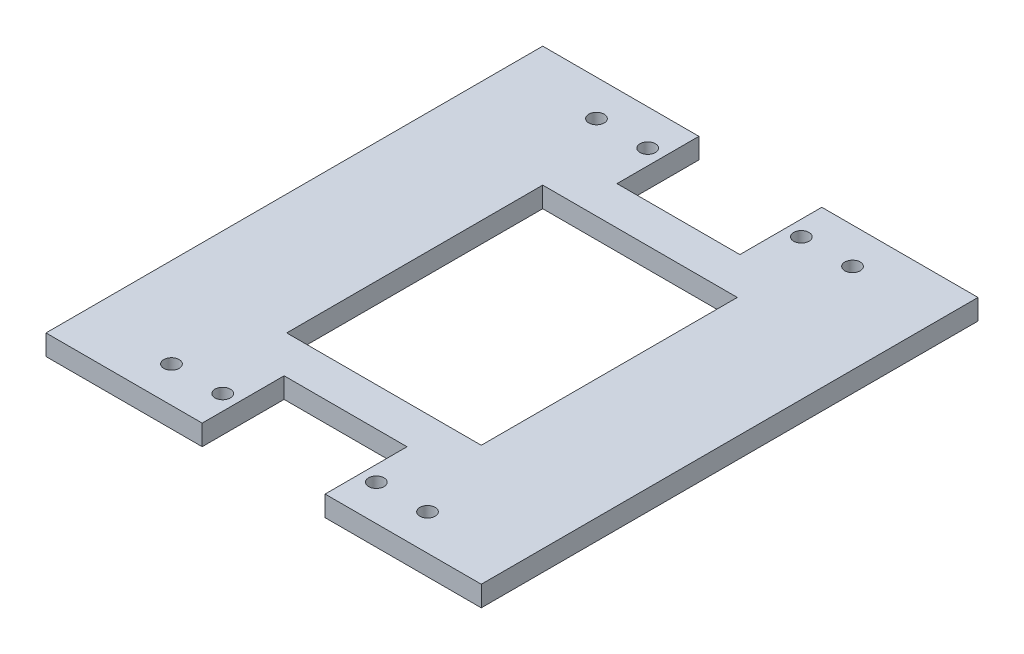
ISO-10303-21;
HEADER;
FILE_DESCRIPTION(('STEP AP214'),'2;1');
FILE_NAME('part.step','',(''),(''),'','','');
FILE_SCHEMA(('AUTOMOTIVE_DESIGN { 1 0 10303 214 1 1 1 1 }'));
ENDSEC;
DATA;
#1=APPLICATION_CONTEXT('core data for automotive mechanical design processes');
#2=APPLICATION_PROTOCOL_DEFINITION('international standard','automotive_design',2000,#1);
#3=PRODUCT_CONTEXT('',#1,'mechanical');
#4=PRODUCT('Part','Part','',(#3));
#5=PRODUCT_RELATED_PRODUCT_CATEGORY('part','',(#4));
#6=PRODUCT_DEFINITION_FORMATION('','',#4);
#7=PRODUCT_DEFINITION_CONTEXT('part definition',#1,'design');
#8=PRODUCT_DEFINITION('design','',#6,#7);
#9=PRODUCT_DEFINITION_SHAPE('','',#8);
#10=(LENGTH_UNIT() NAMED_UNIT(*) SI_UNIT(.MILLI.,.METRE.));
#11=(NAMED_UNIT(*) PLANE_ANGLE_UNIT() SI_UNIT($,.RADIAN.));
#12=(NAMED_UNIT(*) SI_UNIT($,.STERADIAN.) SOLID_ANGLE_UNIT());
#13=UNCERTAINTY_MEASURE_WITH_UNIT(LENGTH_MEASURE(1.E-05),#10,'distance_accuracy_value','');
#14=(GEOMETRIC_REPRESENTATION_CONTEXT(3) GLOBAL_UNCERTAINTY_ASSIGNED_CONTEXT((#13)) GLOBAL_UNIT_ASSIGNED_CONTEXT((#10,
#11,#12)) REPRESENTATION_CONTEXT('',''));
#15=CARTESIAN_POINT('',(0.,0.,0.));
#16=DIRECTION('',(0.,0.,1.));
#17=DIRECTION('',(1.,0.,0.));
#18=AXIS2_PLACEMENT_3D('',#15,#16,#17);
#19=CARTESIAN_POINT('',(0.,4.,0.));
#20=DIRECTION('',(0.,-1.,0.));
#21=DIRECTION('',(0.,0.,-1.));
#22=AXIS2_PLACEMENT_3D('',#19,#20,#21);
#23=PLANE('',#22);
#24=CARTESIAN_POINT('',(-25.,4.,41.5));
#25=DIRECTION('',(0.,1.,0.));
#26=DIRECTION('',(0.,0.,1.));
#27=AXIS2_PLACEMENT_3D('',#24,#25,#26);
#28=CIRCLE('',#27,1.5);
#29=CARTESIAN_POINT('',(-25.,4.,43.));
#30=VERTEX_POINT('',#29);
#31=EDGE_CURVE('E190',#30,#30,#28,.T.);
#32=ORIENTED_EDGE('',*,*,#31,.F.);
#33=EDGE_LOOP('',(#32));
#34=FACE_BOUND('',#33,.T.);
#35=CARTESIAN_POINT('',(-15.,4.,41.5));
#36=DIRECTION('',(0.,1.,0.));
#37=DIRECTION('',(0.,0.,1.));
#38=AXIS2_PLACEMENT_3D('',#35,#36,#37);
#39=CIRCLE('',#38,1.5);
#40=CARTESIAN_POINT('',(-15.,4.,43.));
#41=VERTEX_POINT('',#40);
#42=EDGE_CURVE('E196',#41,#41,#39,.T.);
#43=ORIENTED_EDGE('',*,*,#42,.F.);
#44=EDGE_LOOP('',(#43));
#45=FACE_BOUND('',#44,.T.);
#46=CARTESIAN_POINT('',(15.,4.,41.5));
#47=DIRECTION('',(0.,1.,0.));
#48=DIRECTION('',(0.,0.,-1.));
#49=AXIS2_PLACEMENT_3D('',#46,#47,#48);
#50=CIRCLE('',#49,1.5);
#51=CARTESIAN_POINT('',(15.,4.,40.));
#52=VERTEX_POINT('',#51);
#53=EDGE_CURVE('E202',#52,#52,#50,.T.);
#54=ORIENTED_EDGE('',*,*,#53,.F.);
#55=EDGE_LOOP('',(#54));
#56=FACE_BOUND('',#55,.T.);
#57=CARTESIAN_POINT('',(25.,4.,41.5));
#58=DIRECTION('',(0.,1.,0.));
#59=DIRECTION('',(0.,0.,-1.));
#60=AXIS2_PLACEMENT_3D('',#57,#58,#59);
#61=CIRCLE('',#60,1.5);
#62=CARTESIAN_POINT('',(25.,4.,40.));
#63=VERTEX_POINT('',#62);
#64=EDGE_CURVE('E208',#63,#63,#61,.T.);
#65=ORIENTED_EDGE('',*,*,#64,.F.);
#66=EDGE_LOOP('',(#65));
#67=FACE_BOUND('',#66,.T.);
#68=CARTESIAN_POINT('',(-15.,4.,-41.5));
#69=DIRECTION('',(0.,1.,0.));
#70=DIRECTION('',(0.,0.,-1.));
#71=AXIS2_PLACEMENT_3D('',#68,#69,#70);
#72=CIRCLE('',#71,1.5);
#73=CARTESIAN_POINT('',(-15.,4.,-43.));
#74=VERTEX_POINT('',#73);
#75=EDGE_CURVE('E214',#74,#74,#72,.T.);
#76=ORIENTED_EDGE('',*,*,#75,.F.);
#77=EDGE_LOOP('',(#76));
#78=FACE_BOUND('',#77,.T.);
#79=CARTESIAN_POINT('',(-25.,4.,-41.5));
#80=DIRECTION('',(0.,1.,0.));
#81=DIRECTION('',(0.,0.,-1.));
#82=AXIS2_PLACEMENT_3D('',#79,#80,#81);
#83=CIRCLE('',#82,1.5);
#84=CARTESIAN_POINT('',(-25.,4.,-43.));
#85=VERTEX_POINT('',#84);
#86=EDGE_CURVE('E220',#85,#85,#83,.T.);
#87=ORIENTED_EDGE('',*,*,#86,.F.);
#88=EDGE_LOOP('',(#87));
#89=FACE_BOUND('',#88,.T.);
#90=CARTESIAN_POINT('',(25.,4.,-41.5));
#91=DIRECTION('',(0.,1.,0.));
#92=DIRECTION('',(0.,0.,1.));
#93=AXIS2_PLACEMENT_3D('',#90,#91,#92);
#94=CIRCLE('',#93,1.5);
#95=CARTESIAN_POINT('',(25.,4.,-40.));
#96=VERTEX_POINT('',#95);
#97=EDGE_CURVE('E226',#96,#96,#94,.T.);
#98=ORIENTED_EDGE('',*,*,#97,.F.);
#99=EDGE_LOOP('',(#98));
#100=FACE_BOUND('',#99,.T.);
#101=CARTESIAN_POINT('',(15.,4.,-41.5));
#102=DIRECTION('',(0.,1.,0.));
#103=DIRECTION('',(0.,0.,1.));
#104=AXIS2_PLACEMENT_3D('',#101,#102,#103);
#105=CIRCLE('',#104,1.5);
#106=CARTESIAN_POINT('',(15.,4.,-40.));
#107=VERTEX_POINT('',#106);
#108=EDGE_CURVE('E232',#107,#107,#105,.T.);
#109=ORIENTED_EDGE('',*,*,#108,.F.);
#110=EDGE_LOOP('',(#109));
#111=FACE_BOUND('',#110,.T.);
#112=DIRECTION('',(1.,0.,0.));
#113=VECTOR('',#112,1.);
#114=CARTESIAN_POINT('',(12.,4.,48.5));
#115=LINE('',#114,#113);
#116=CARTESIAN_POINT('',(12.,4.,48.5));
#117=VERTEX_POINT('',#116);
#118=CARTESIAN_POINT('',(42.5,4.,48.5));
#119=VERTEX_POINT('',#118);
#120=EDGE_CURVE('E238',#117,#119,#115,.T.);
#121=ORIENTED_EDGE('',*,*,#120,.T.);
#122=DIRECTION('',(0.,0.,-1.));
#123=VECTOR('',#122,1.);
#124=CARTESIAN_POINT('',(42.5,4.,-48.5));
#125=LINE('',#124,#123);
#126=CARTESIAN_POINT('',(42.5,4.,-48.5));
#127=VERTEX_POINT('',#126);
#128=EDGE_CURVE('E241',#119,#127,#125,.T.);
#129=ORIENTED_EDGE('',*,*,#128,.T.);
#130=DIRECTION('',(-1.,0.,0.));
#131=VECTOR('',#130,1.);
#132=CARTESIAN_POINT('',(12.,4.,-48.5));
#133=LINE('',#132,#131);
#134=CARTESIAN_POINT('',(12.,4.,-48.5));
#135=VERTEX_POINT('',#134);
#136=EDGE_CURVE('E244',#127,#135,#133,.T.);
#137=ORIENTED_EDGE('',*,*,#136,.T.);
#138=DIRECTION('',(0.,0.,1.));
#139=VECTOR('',#138,1.);
#140=CARTESIAN_POINT('',(12.,4.,-32.5));
#141=LINE('',#140,#139);
#142=CARTESIAN_POINT('',(12.,4.,-32.5));
#143=VERTEX_POINT('',#142);
#144=EDGE_CURVE('E246',#135,#143,#141,.T.);
#145=ORIENTED_EDGE('',*,*,#144,.T.);
#146=DIRECTION('',(-1.,0.,0.));
#147=VECTOR('',#146,1.);
#148=CARTESIAN_POINT('',(-12.,4.,-32.5));
#149=LINE('',#148,#147);
#150=CARTESIAN_POINT('',(-12.,4.,-32.5));
#151=VERTEX_POINT('',#150);
#152=EDGE_CURVE('E248',#143,#151,#149,.T.);
#153=ORIENTED_EDGE('',*,*,#152,.T.);
#154=DIRECTION('',(0.,0.,-1.));
#155=VECTOR('',#154,1.);
#156=CARTESIAN_POINT('',(-12.,4.,-48.5));
#157=LINE('',#156,#155);
#158=CARTESIAN_POINT('',(-12.,4.,-48.5));
#159=VERTEX_POINT('',#158);
#160=EDGE_CURVE('E250',#151,#159,#157,.T.);
#161=ORIENTED_EDGE('',*,*,#160,.T.);
#162=DIRECTION('',(-1.,0.,0.));
#163=VECTOR('',#162,1.);
#164=CARTESIAN_POINT('',(-42.5,4.,-48.5));
#165=LINE('',#164,#163);
#166=CARTESIAN_POINT('',(-42.5,4.,-48.5));
#167=VERTEX_POINT('',#166);
#168=EDGE_CURVE('E252',#159,#167,#165,.T.);
#169=ORIENTED_EDGE('',*,*,#168,.T.);
#170=DIRECTION('',(0.,0.,1.));
#171=VECTOR('',#170,1.);
#172=CARTESIAN_POINT('',(-42.5,4.,-48.5));
#173=LINE('',#172,#171);
#174=CARTESIAN_POINT('',(-42.5,4.,48.5));
#175=VERTEX_POINT('',#174);
#176=EDGE_CURVE('E254',#167,#175,#173,.T.);
#177=ORIENTED_EDGE('',*,*,#176,.T.);
#178=DIRECTION('',(1.,0.,0.));
#179=VECTOR('',#178,1.);
#180=CARTESIAN_POINT('',(-42.5,4.,48.5));
#181=LINE('',#180,#179);
#182=CARTESIAN_POINT('',(-12.,4.,48.5));
#183=VERTEX_POINT('',#182);
#184=EDGE_CURVE('E256',#175,#183,#181,.T.);
#185=ORIENTED_EDGE('',*,*,#184,.T.);
#186=DIRECTION('',(0.,0.,-1.));
#187=VECTOR('',#186,1.);
#188=CARTESIAN_POINT('',(-12.,4.,48.5));
#189=LINE('',#188,#187);
#190=CARTESIAN_POINT('',(-12.,4.,32.5));
#191=VERTEX_POINT('',#190);
#192=EDGE_CURVE('E258',#183,#191,#189,.T.);
#193=ORIENTED_EDGE('',*,*,#192,.T.);
#194=DIRECTION('',(1.,0.,0.));
#195=VECTOR('',#194,1.);
#196=CARTESIAN_POINT('',(-12.,4.,32.5));
#197=LINE('',#196,#195);
#198=CARTESIAN_POINT('',(12.,4.,32.5));
#199=VERTEX_POINT('',#198);
#200=EDGE_CURVE('E260',#191,#199,#197,.T.);
#201=ORIENTED_EDGE('',*,*,#200,.T.);
#202=DIRECTION('',(0.,0.,1.));
#203=VECTOR('',#202,1.);
#204=CARTESIAN_POINT('',(12.,4.,32.5));
#205=LINE('',#204,#203);
#206=EDGE_CURVE('E262',#199,#117,#205,.T.);
#207=ORIENTED_EDGE('',*,*,#206,.T.);
#208=EDGE_LOOP('',(#121,#129,#137,#145,#153,#161,#169,#177,#185,#193,#201,#207));
#209=FACE_BOUND('',#208,.T.);
#210=DIRECTION('',(0.,0.,-1.));
#211=VECTOR('',#210,1.);
#212=CARTESIAN_POINT('',(19.,4.,-25.));
#213=LINE('',#212,#211);
#214=CARTESIAN_POINT('',(19.,4.,25.));
#215=VERTEX_POINT('',#214);
#216=CARTESIAN_POINT('',(19.,4.,-25.));
#217=VERTEX_POINT('',#216);
#218=EDGE_CURVE('E154',#215,#217,#213,.T.);
#219=ORIENTED_EDGE('',*,*,#218,.F.);
#220=DIRECTION('',(1.,0.,0.));
#221=VECTOR('',#220,1.);
#222=CARTESIAN_POINT('',(-19.,4.,25.));
#223=LINE('',#222,#221);
#224=CARTESIAN_POINT('',(-19.,4.,25.));
#225=VERTEX_POINT('',#224);
#226=EDGE_CURVE('E176',#225,#215,#223,.T.);
#227=ORIENTED_EDGE('',*,*,#226,.F.);
#228=DIRECTION('',(0.,0.,1.));
#229=VECTOR('',#228,1.);
#230=CARTESIAN_POINT('',(-19.,4.,-25.));
#231=LINE('',#230,#229);
#232=CARTESIAN_POINT('',(-19.,4.,-25.));
#233=VERTEX_POINT('',#232);
#234=EDGE_CURVE('E174',#233,#225,#231,.T.);
#235=ORIENTED_EDGE('',*,*,#234,.F.);
#236=DIRECTION('',(-1.,0.,0.));
#237=VECTOR('',#236,1.);
#238=CARTESIAN_POINT('',(-19.,4.,-25.));
#239=LINE('',#238,#237);
#240=EDGE_CURVE('E162',#217,#233,#239,.T.);
#241=ORIENTED_EDGE('',*,*,#240,.F.);
#242=EDGE_LOOP('',(#219,#227,#235,#241));
#243=FACE_BOUND('',#242,.T.);
#244=ADVANCED_FACE('F41',(#34,#45,#56,#67,#78,#89,#100,#111,#209,#243),#23,.F.);
#245=CARTESIAN_POINT('',(0.,0.,0.));
#246=DIRECTION('',(0.,-1.,0.));
#247=DIRECTION('',(0.,0.,-1.));
#248=AXIS2_PLACEMENT_3D('',#245,#246,#247);
#249=PLANE('',#248);
#250=CARTESIAN_POINT('',(-15.,0.,41.5));
#251=DIRECTION('',(0.,1.,0.));
#252=DIRECTION('',(0.,0.,1.));
#253=AXIS2_PLACEMENT_3D('',#250,#251,#252);
#254=CIRCLE('',#253,1.5);
#255=CARTESIAN_POINT('',(-15.,0.,43.));
#256=VERTEX_POINT('',#255);
#257=EDGE_CURVE('E193',#256,#256,#254,.T.);
#258=ORIENTED_EDGE('',*,*,#257,.T.);
#259=EDGE_LOOP('',(#258));
#260=FACE_BOUND('',#259,.T.);
#261=CARTESIAN_POINT('',(25.,0.,41.5));
#262=DIRECTION('',(0.,1.,0.));
#263=DIRECTION('',(0.,0.,-1.));
#264=AXIS2_PLACEMENT_3D('',#261,#262,#263);
#265=CIRCLE('',#264,1.5);
#266=CARTESIAN_POINT('',(25.,0.,40.));
#267=VERTEX_POINT('',#266);
#268=EDGE_CURVE('E205',#267,#267,#265,.T.);
#269=ORIENTED_EDGE('',*,*,#268,.T.);
#270=EDGE_LOOP('',(#269));
#271=FACE_BOUND('',#270,.T.);
#272=CARTESIAN_POINT('',(-25.,0.,-41.5));
#273=DIRECTION('',(0.,1.,0.));
#274=DIRECTION('',(0.,0.,-1.));
#275=AXIS2_PLACEMENT_3D('',#272,#273,#274);
#276=CIRCLE('',#275,1.5);
#277=CARTESIAN_POINT('',(-25.,0.,-43.));
#278=VERTEX_POINT('',#277);
#279=EDGE_CURVE('E217',#278,#278,#276,.T.);
#280=ORIENTED_EDGE('',*,*,#279,.T.);
#281=EDGE_LOOP('',(#280));
#282=FACE_BOUND('',#281,.T.);
#283=CARTESIAN_POINT('',(15.,0.,-41.5));
#284=DIRECTION('',(0.,1.,0.));
#285=DIRECTION('',(0.,0.,1.));
#286=AXIS2_PLACEMENT_3D('',#283,#284,#285);
#287=CIRCLE('',#286,1.5);
#288=CARTESIAN_POINT('',(15.,0.,-40.));
#289=VERTEX_POINT('',#288);
#290=EDGE_CURVE('E229',#289,#289,#287,.T.);
#291=ORIENTED_EDGE('',*,*,#290,.T.);
#292=EDGE_LOOP('',(#291));
#293=FACE_BOUND('',#292,.T.);
#294=DIRECTION('',(1.,0.,0.));
#295=VECTOR('',#294,1.);
#296=CARTESIAN_POINT('',(12.,0.,48.5));
#297=LINE('',#296,#295);
#298=CARTESIAN_POINT('',(12.,0.,48.5));
#299=VERTEX_POINT('',#298);
#300=CARTESIAN_POINT('',(42.5,0.,48.5));
#301=VERTEX_POINT('',#300);
#302=EDGE_CURVE('E235',#299,#301,#297,.T.);
#303=ORIENTED_EDGE('',*,*,#302,.F.);
#304=DIRECTION('',(0.,0.,1.));
#305=VECTOR('',#304,1.);
#306=CARTESIAN_POINT('',(12.,0.,32.5));
#307=LINE('',#306,#305);
#308=CARTESIAN_POINT('',(12.,0.,32.5));
#309=VERTEX_POINT('',#308);
#310=EDGE_CURVE('E242',#309,#299,#307,.T.);
#311=ORIENTED_EDGE('',*,*,#310,.F.);
#312=DIRECTION('',(1.,0.,0.));
#313=VECTOR('',#312,1.);
#314=CARTESIAN_POINT('',(-12.,0.,32.5));
#315=LINE('',#314,#313);
#316=CARTESIAN_POINT('',(-12.,0.,32.5));
#317=VERTEX_POINT('',#316);
#318=EDGE_CURVE('E285',#317,#309,#315,.T.);
#319=ORIENTED_EDGE('',*,*,#318,.F.);
#320=DIRECTION('',(0.,0.,-1.));
#321=VECTOR('',#320,1.);
#322=CARTESIAN_POINT('',(-12.,0.,48.5));
#323=LINE('',#322,#321);
#324=CARTESIAN_POINT('',(-12.,0.,48.5));
#325=VERTEX_POINT('',#324);
#326=EDGE_CURVE('E283',#325,#317,#323,.T.);
#327=ORIENTED_EDGE('',*,*,#326,.F.);
#328=DIRECTION('',(1.,0.,0.));
#329=VECTOR('',#328,1.);
#330=CARTESIAN_POINT('',(-42.5,0.,48.5));
#331=LINE('',#330,#329);
#332=CARTESIAN_POINT('',(-42.5,0.,48.5));
#333=VERTEX_POINT('',#332);
#334=EDGE_CURVE('E281',#333,#325,#331,.T.);
#335=ORIENTED_EDGE('',*,*,#334,.F.);
#336=DIRECTION('',(0.,0.,1.));
#337=VECTOR('',#336,1.);
#338=CARTESIAN_POINT('',(-42.5,0.,-48.5));
#339=LINE('',#338,#337);
#340=CARTESIAN_POINT('',(-42.5,0.,-48.5));
#341=VERTEX_POINT('',#340);
#342=EDGE_CURVE('E279',#341,#333,#339,.T.);
#343=ORIENTED_EDGE('',*,*,#342,.F.);
#344=DIRECTION('',(-1.,0.,0.));
#345=VECTOR('',#344,1.);
#346=CARTESIAN_POINT('',(-42.5,0.,-48.5));
#347=LINE('',#346,#345);
#348=CARTESIAN_POINT('',(-12.,0.,-48.5));
#349=VERTEX_POINT('',#348);
#350=EDGE_CURVE('E277',#349,#341,#347,.T.);
#351=ORIENTED_EDGE('',*,*,#350,.F.);
#352=DIRECTION('',(0.,0.,-1.));
#353=VECTOR('',#352,1.);
#354=CARTESIAN_POINT('',(-12.,0.,-48.5));
#355=LINE('',#354,#353);
#356=CARTESIAN_POINT('',(-12.,0.,-32.5));
#357=VERTEX_POINT('',#356);
#358=EDGE_CURVE('E275',#357,#349,#355,.T.);
#359=ORIENTED_EDGE('',*,*,#358,.F.);
#360=DIRECTION('',(-1.,0.,0.));
#361=VECTOR('',#360,1.);
#362=CARTESIAN_POINT('',(-12.,0.,-32.5));
#363=LINE('',#362,#361);
#364=CARTESIAN_POINT('',(12.,0.,-32.5));
#365=VERTEX_POINT('',#364);
#366=EDGE_CURVE('E273',#365,#357,#363,.T.);
#367=ORIENTED_EDGE('',*,*,#366,.F.);
#368=DIRECTION('',(0.,0.,1.));
#369=VECTOR('',#368,1.);
#370=CARTESIAN_POINT('',(12.,0.,-32.5));
#371=LINE('',#370,#369);
#372=CARTESIAN_POINT('',(12.,0.,-48.5));
#373=VERTEX_POINT('',#372);
#374=EDGE_CURVE('E271',#373,#365,#371,.T.);
#375=ORIENTED_EDGE('',*,*,#374,.F.);
#376=DIRECTION('',(-1.,0.,0.));
#377=VECTOR('',#376,1.);
#378=CARTESIAN_POINT('',(12.,0.,-48.5));
#379=LINE('',#378,#377);
#380=CARTESIAN_POINT('',(42.5,0.,-48.5));
#381=VERTEX_POINT('',#380);
#382=EDGE_CURVE('E269',#381,#373,#379,.T.);
#383=ORIENTED_EDGE('',*,*,#382,.F.);
#384=DIRECTION('',(0.,0.,-1.));
#385=VECTOR('',#384,1.);
#386=CARTESIAN_POINT('',(42.5,0.,-48.5));
#387=LINE('',#386,#385);
#388=EDGE_CURVE('E267',#301,#381,#387,.T.);
#389=ORIENTED_EDGE('',*,*,#388,.F.);
#390=EDGE_LOOP('',(#303,#311,#319,#327,#335,#343,#351,#359,#367,#375,#383,#389));
#391=FACE_BOUND('',#390,.T.);
#392=CARTESIAN_POINT('',(25.,0.,-41.5));
#393=DIRECTION('',(0.,1.,0.));
#394=DIRECTION('',(0.,0.,1.));
#395=AXIS2_PLACEMENT_3D('',#392,#393,#394);
#396=CIRCLE('',#395,1.5);
#397=CARTESIAN_POINT('',(25.,0.,-40.));
#398=VERTEX_POINT('',#397);
#399=EDGE_CURVE('E223',#398,#398,#396,.T.);
#400=ORIENTED_EDGE('',*,*,#399,.T.);
#401=EDGE_LOOP('',(#400));
#402=FACE_BOUND('',#401,.T.);
#403=CARTESIAN_POINT('',(-15.,0.,-41.5));
#404=DIRECTION('',(0.,1.,0.));
#405=DIRECTION('',(0.,0.,-1.));
#406=AXIS2_PLACEMENT_3D('',#403,#404,#405);
#407=CIRCLE('',#406,1.5);
#408=CARTESIAN_POINT('',(-15.,0.,-43.));
#409=VERTEX_POINT('',#408);
#410=EDGE_CURVE('E211',#409,#409,#407,.T.);
#411=ORIENTED_EDGE('',*,*,#410,.T.);
#412=EDGE_LOOP('',(#411));
#413=FACE_BOUND('',#412,.T.);
#414=CARTESIAN_POINT('',(15.,0.,41.5));
#415=DIRECTION('',(0.,1.,0.));
#416=DIRECTION('',(0.,0.,-1.));
#417=AXIS2_PLACEMENT_3D('',#414,#415,#416);
#418=CIRCLE('',#417,1.5);
#419=CARTESIAN_POINT('',(15.,0.,40.));
#420=VERTEX_POINT('',#419);
#421=EDGE_CURVE('E199',#420,#420,#418,.T.);
#422=ORIENTED_EDGE('',*,*,#421,.T.);
#423=EDGE_LOOP('',(#422));
#424=FACE_BOUND('',#423,.T.);
#425=CARTESIAN_POINT('',(-25.,0.,41.5));
#426=DIRECTION('',(0.,1.,0.));
#427=DIRECTION('',(0.,0.,1.));
#428=AXIS2_PLACEMENT_3D('',#425,#426,#427);
#429=CIRCLE('',#428,1.5);
#430=CARTESIAN_POINT('',(-25.,0.,43.));
#431=VERTEX_POINT('',#430);
#432=EDGE_CURVE('E170',#431,#431,#429,.T.);
#433=ORIENTED_EDGE('',*,*,#432,.T.);
#434=EDGE_LOOP('',(#433));
#435=FACE_BOUND('',#434,.T.);
#436=DIRECTION('',(1.,0.,0.));
#437=VECTOR('',#436,1.);
#438=CARTESIAN_POINT('',(-19.,0.,25.));
#439=LINE('',#438,#437);
#440=CARTESIAN_POINT('',(-19.,0.,25.));
#441=VERTEX_POINT('',#440);
#442=CARTESIAN_POINT('',(19.,0.,25.));
#443=VERTEX_POINT('',#442);
#444=EDGE_CURVE('E163',#441,#443,#439,.T.);
#445=ORIENTED_EDGE('',*,*,#444,.T.);
#446=DIRECTION('',(0.,0.,-1.));
#447=VECTOR('',#446,1.);
#448=CARTESIAN_POINT('',(19.,0.,-25.));
#449=LINE('',#448,#447);
#450=CARTESIAN_POINT('',(19.,0.,-25.));
#451=VERTEX_POINT('',#450);
#452=EDGE_CURVE('E64',#443,#451,#449,.T.);
#453=ORIENTED_EDGE('',*,*,#452,.T.);
#454=DIRECTION('',(-1.,0.,0.));
#455=VECTOR('',#454,1.);
#456=CARTESIAN_POINT('',(-19.,0.,-25.));
#457=LINE('',#456,#455);
#458=CARTESIAN_POINT('',(-19.,0.,-25.));
#459=VERTEX_POINT('',#458);
#460=EDGE_CURVE('E169',#451,#459,#457,.T.);
#461=ORIENTED_EDGE('',*,*,#460,.T.);
#462=DIRECTION('',(0.,0.,1.));
#463=VECTOR('',#462,1.);
#464=CARTESIAN_POINT('',(-19.,0.,-25.));
#465=LINE('',#464,#463);
#466=EDGE_CURVE('E182',#459,#441,#465,.T.);
#467=ORIENTED_EDGE('',*,*,#466,.T.);
#468=EDGE_LOOP('',(#445,#453,#461,#467));
#469=FACE_BOUND('',#468,.T.);
#470=ADVANCED_FACE('F327',(#260,#271,#282,#293,#391,#402,#413,#424,#435,#469),#249,.T.);
#471=CARTESIAN_POINT('',(12.,4.,48.5));
#472=DIRECTION('',(0.,0.,-1.));
#473=DIRECTION('',(-1.,0.,0.));
#474=AXIS2_PLACEMENT_3D('',#471,#472,#473);
#475=PLANE('',#474);
#476=ORIENTED_EDGE('',*,*,#302,.T.);
#477=DIRECTION('',(0.,-1.,0.));
#478=VECTOR('',#477,1.);
#479=CARTESIAN_POINT('',(42.5,4.,48.5));
#480=LINE('',#479,#478);
#481=EDGE_CURVE('E11',#119,#301,#480,.T.);
#482=ORIENTED_EDGE('',*,*,#481,.F.);
#483=ORIENTED_EDGE('',*,*,#120,.F.);
#484=DIRECTION('',(0.,-1.,0.));
#485=VECTOR('',#484,1.);
#486=CARTESIAN_POINT('',(12.,4.,48.5));
#487=LINE('',#486,#485);
#488=EDGE_CURVE('E264',#117,#299,#487,.T.);
#489=ORIENTED_EDGE('',*,*,#488,.T.);
#490=EDGE_LOOP('',(#476,#482,#483,#489));
#491=FACE_BOUND('',#490,.T.);
#492=ADVANCED_FACE('F43',(#491),#475,.F.);
#493=CARTESIAN_POINT('',(42.5,4.,-48.5));
#494=DIRECTION('',(-1.,0.,0.));
#495=DIRECTION('',(0.,0.,1.));
#496=AXIS2_PLACEMENT_3D('',#493,#494,#495);
#497=PLANE('',#496);
#498=ORIENTED_EDGE('',*,*,#388,.T.);
#499=DIRECTION('',(0.,-1.,0.));
#500=VECTOR('',#499,1.);
#501=CARTESIAN_POINT('',(42.5,4.,-48.5));
#502=LINE('',#501,#500);
#503=EDGE_CURVE('E49',#127,#381,#502,.T.);
#504=ORIENTED_EDGE('',*,*,#503,.F.);
#505=ORIENTED_EDGE('',*,*,#128,.F.);
#506=ORIENTED_EDGE('',*,*,#481,.T.);
#507=EDGE_LOOP('',(#498,#504,#505,#506));
#508=FACE_BOUND('',#507,.T.);
#509=ADVANCED_FACE('F344',(#508),#497,.F.);
#510=CARTESIAN_POINT('',(12.,4.,-48.5));
#511=DIRECTION('',(0.,0.,1.));
#512=DIRECTION('',(1.,0.,0.));
#513=AXIS2_PLACEMENT_3D('',#510,#511,#512);
#514=PLANE('',#513);
#515=ORIENTED_EDGE('',*,*,#382,.T.);
#516=DIRECTION('',(0.,-1.,0.));
#517=VECTOR('',#516,1.);
#518=CARTESIAN_POINT('',(12.,4.,-48.5));
#519=LINE('',#518,#517);
#520=EDGE_CURVE('E314',#135,#373,#519,.T.);
#521=ORIENTED_EDGE('',*,*,#520,.F.);
#522=ORIENTED_EDGE('',*,*,#136,.F.);
#523=ORIENTED_EDGE('',*,*,#503,.T.);
#524=EDGE_LOOP('',(#515,#521,#522,#523));
#525=FACE_BOUND('',#524,.T.);
#526=ADVANCED_FACE('F321',(#525),#514,.F.);
#527=CARTESIAN_POINT('',(12.,4.,-32.5));
#528=DIRECTION('',(1.,0.,0.));
#529=DIRECTION('',(0.,0.,-1.));
#530=AXIS2_PLACEMENT_3D('',#527,#528,#529);
#531=PLANE('',#530);
#532=ORIENTED_EDGE('',*,*,#374,.T.);
#533=DIRECTION('',(0.,-1.,0.));
#534=VECTOR('',#533,1.);
#535=CARTESIAN_POINT('',(12.,4.,-32.5));
#536=LINE('',#535,#534);
#537=EDGE_CURVE('E311',#143,#365,#536,.T.);
#538=ORIENTED_EDGE('',*,*,#537,.F.);
#539=ORIENTED_EDGE('',*,*,#144,.F.);
#540=ORIENTED_EDGE('',*,*,#520,.T.);
#541=EDGE_LOOP('',(#532,#538,#539,#540));
#542=FACE_BOUND('',#541,.T.);
#543=ADVANCED_FACE('F333',(#542),#531,.F.);
#544=CARTESIAN_POINT('',(-12.,4.,-32.5));
#545=DIRECTION('',(0.,0.,1.));
#546=DIRECTION('',(1.,0.,0.));
#547=AXIS2_PLACEMENT_3D('',#544,#545,#546);
#548=PLANE('',#547);
#549=ORIENTED_EDGE('',*,*,#366,.T.);
#550=DIRECTION('',(0.,-1.,0.));
#551=VECTOR('',#550,1.);
#552=CARTESIAN_POINT('',(-12.,4.,-32.5));
#553=LINE('',#552,#551);
#554=EDGE_CURVE('E308',#151,#357,#553,.T.);
#555=ORIENTED_EDGE('',*,*,#554,.F.);
#556=ORIENTED_EDGE('',*,*,#152,.F.);
#557=ORIENTED_EDGE('',*,*,#537,.T.);
#558=EDGE_LOOP('',(#549,#555,#556,#557));
#559=FACE_BOUND('',#558,.T.);
#560=ADVANCED_FACE('F337',(#559),#548,.F.);
#561=CARTESIAN_POINT('',(-12.,4.,-48.5));
#562=DIRECTION('',(-1.,0.,0.));
#563=DIRECTION('',(0.,0.,1.));
#564=AXIS2_PLACEMENT_3D('',#561,#562,#563);
#565=PLANE('',#564);
#566=ORIENTED_EDGE('',*,*,#358,.T.);
#567=DIRECTION('',(0.,-1.,0.));
#568=VECTOR('',#567,1.);
#569=CARTESIAN_POINT('',(-12.,4.,-48.5));
#570=LINE('',#569,#568);
#571=EDGE_CURVE('E305',#159,#349,#570,.T.);
#572=ORIENTED_EDGE('',*,*,#571,.F.);
#573=ORIENTED_EDGE('',*,*,#160,.F.);
#574=ORIENTED_EDGE('',*,*,#554,.T.);
#575=EDGE_LOOP('',(#566,#572,#573,#574));
#576=FACE_BOUND('',#575,.T.);
#577=ADVANCED_FACE('F377',(#576),#565,.F.);
#578=CARTESIAN_POINT('',(-42.5,4.,-48.5));
#579=DIRECTION('',(0.,0.,1.));
#580=DIRECTION('',(1.,0.,0.));
#581=AXIS2_PLACEMENT_3D('',#578,#579,#580);
#582=PLANE('',#581);
#583=ORIENTED_EDGE('',*,*,#350,.T.);
#584=DIRECTION('',(0.,-1.,0.));
#585=VECTOR('',#584,1.);
#586=CARTESIAN_POINT('',(-42.5,4.,-48.5));
#587=LINE('',#586,#585);
#588=EDGE_CURVE('E302',#167,#341,#587,.T.);
#589=ORIENTED_EDGE('',*,*,#588,.F.);
#590=ORIENTED_EDGE('',*,*,#168,.F.);
#591=ORIENTED_EDGE('',*,*,#571,.T.);
#592=EDGE_LOOP('',(#583,#589,#590,#591));
#593=FACE_BOUND('',#592,.T.);
#594=ADVANCED_FACE('F375',(#593),#582,.F.);
#595=CARTESIAN_POINT('',(-42.5,4.,-48.5));
#596=DIRECTION('',(1.,0.,0.));
#597=DIRECTION('',(0.,0.,-1.));
#598=AXIS2_PLACEMENT_3D('',#595,#596,#597);
#599=PLANE('',#598);
#600=ORIENTED_EDGE('',*,*,#342,.T.);
#601=DIRECTION('',(0.,-1.,0.));
#602=VECTOR('',#601,1.);
#603=CARTESIAN_POINT('',(-42.5,4.,48.5));
#604=LINE('',#603,#602);
#605=EDGE_CURVE('E299',#175,#333,#604,.T.);
#606=ORIENTED_EDGE('',*,*,#605,.F.);
#607=ORIENTED_EDGE('',*,*,#176,.F.);
#608=ORIENTED_EDGE('',*,*,#588,.T.);
#609=EDGE_LOOP('',(#600,#606,#607,#608));
#610=FACE_BOUND('',#609,.T.);
#611=ADVANCED_FACE('F371',(#610),#599,.F.);
#612=CARTESIAN_POINT('',(-42.5,4.,48.5));
#613=DIRECTION('',(0.,0.,-1.));
#614=DIRECTION('',(-1.,0.,0.));
#615=AXIS2_PLACEMENT_3D('',#612,#613,#614);
#616=PLANE('',#615);
#617=ORIENTED_EDGE('',*,*,#334,.T.);
#618=DIRECTION('',(0.,-1.,0.));
#619=VECTOR('',#618,1.);
#620=CARTESIAN_POINT('',(-12.,4.,48.5));
#621=LINE('',#620,#619);
#622=EDGE_CURVE('E296',#183,#325,#621,.T.);
#623=ORIENTED_EDGE('',*,*,#622,.F.);
#624=ORIENTED_EDGE('',*,*,#184,.F.);
#625=ORIENTED_EDGE('',*,*,#605,.T.);
#626=EDGE_LOOP('',(#617,#623,#624,#625));
#627=FACE_BOUND('',#626,.T.);
#628=ADVANCED_FACE('F366',(#627),#616,.F.);
#629=CARTESIAN_POINT('',(-12.,4.,48.5));
#630=DIRECTION('',(-1.,0.,0.));
#631=DIRECTION('',(0.,0.,1.));
#632=AXIS2_PLACEMENT_3D('',#629,#630,#631);
#633=PLANE('',#632);
#634=ORIENTED_EDGE('',*,*,#326,.T.);
#635=DIRECTION('',(0.,-1.,0.));
#636=VECTOR('',#635,1.);
#637=CARTESIAN_POINT('',(-12.,4.,32.5));
#638=LINE('',#637,#636);
#639=EDGE_CURVE('E293',#191,#317,#638,.T.);
#640=ORIENTED_EDGE('',*,*,#639,.F.);
#641=ORIENTED_EDGE('',*,*,#192,.F.);
#642=ORIENTED_EDGE('',*,*,#622,.T.);
#643=EDGE_LOOP('',(#634,#640,#641,#642));
#644=FACE_BOUND('',#643,.T.);
#645=ADVANCED_FACE('F360',(#644),#633,.F.);
#646=CARTESIAN_POINT('',(-12.,4.,32.5));
#647=DIRECTION('',(0.,0.,-1.));
#648=DIRECTION('',(-1.,0.,0.));
#649=AXIS2_PLACEMENT_3D('',#646,#647,#648);
#650=PLANE('',#649);
#651=ORIENTED_EDGE('',*,*,#318,.T.);
#652=DIRECTION('',(0.,-1.,0.));
#653=VECTOR('',#652,1.);
#654=CARTESIAN_POINT('',(12.,4.,32.5));
#655=LINE('',#654,#653);
#656=EDGE_CURVE('E290',#199,#309,#655,.T.);
#657=ORIENTED_EDGE('',*,*,#656,.F.);
#658=ORIENTED_EDGE('',*,*,#200,.F.);
#659=ORIENTED_EDGE('',*,*,#639,.T.);
#660=EDGE_LOOP('',(#651,#657,#658,#659));
#661=FACE_BOUND('',#660,.T.);
#662=ADVANCED_FACE('F356',(#661),#650,.F.);
#663=CARTESIAN_POINT('',(12.,4.,32.5));
#664=DIRECTION('',(1.,0.,0.));
#665=DIRECTION('',(0.,0.,-1.));
#666=AXIS2_PLACEMENT_3D('',#663,#664,#665);
#667=PLANE('',#666);
#668=ORIENTED_EDGE('',*,*,#310,.T.);
#669=ORIENTED_EDGE('',*,*,#488,.F.);
#670=ORIENTED_EDGE('',*,*,#206,.F.);
#671=ORIENTED_EDGE('',*,*,#656,.T.);
#672=EDGE_LOOP('',(#668,#669,#670,#671));
#673=FACE_BOUND('',#672,.T.);
#674=ADVANCED_FACE('F351',(#673),#667,.F.);
#675=CARTESIAN_POINT('',(15.,4.,-41.5));
#676=DIRECTION('',(0.,-1.,0.));
#677=DIRECTION('',(0.,0.,-1.));
#678=AXIS2_PLACEMENT_3D('',#675,#676,#677);
#679=CYLINDRICAL_SURFACE('',#678,1.5);
#680=ORIENTED_EDGE('',*,*,#108,.T.);
#681=EDGE_LOOP('',(#680));
#682=FACE_BOUND('',#681,.T.);
#683=ORIENTED_EDGE('',*,*,#290,.F.);
#684=EDGE_LOOP('',(#683));
#685=FACE_BOUND('',#684,.T.);
#686=ADVANCED_FACE('F397',(#682,#685),#679,.F.);
#687=CARTESIAN_POINT('',(25.,4.,-41.5));
#688=DIRECTION('',(0.,-1.,0.));
#689=DIRECTION('',(0.,0.,-1.));
#690=AXIS2_PLACEMENT_3D('',#687,#688,#689);
#691=CYLINDRICAL_SURFACE('',#690,1.5);
#692=ORIENTED_EDGE('',*,*,#97,.T.);
#693=EDGE_LOOP('',(#692));
#694=FACE_BOUND('',#693,.T.);
#695=ORIENTED_EDGE('',*,*,#399,.F.);
#696=EDGE_LOOP('',(#695));
#697=FACE_BOUND('',#696,.T.);
#698=ADVANCED_FACE('F440',(#694,#697),#691,.F.);
#699=CARTESIAN_POINT('',(-25.,4.,-41.5));
#700=DIRECTION('',(0.,-1.,0.));
#701=DIRECTION('',(0.,0.,-1.));
#702=AXIS2_PLACEMENT_3D('',#699,#700,#701);
#703=CYLINDRICAL_SURFACE('',#702,1.5);
#704=ORIENTED_EDGE('',*,*,#86,.T.);
#705=EDGE_LOOP('',(#704));
#706=FACE_BOUND('',#705,.T.);
#707=ORIENTED_EDGE('',*,*,#279,.F.);
#708=EDGE_LOOP('',(#707));
#709=FACE_BOUND('',#708,.T.);
#710=ADVANCED_FACE('F448',(#706,#709),#703,.F.);
#711=CARTESIAN_POINT('',(-15.,4.,-41.5));
#712=DIRECTION('',(0.,-1.,0.));
#713=DIRECTION('',(0.,0.,-1.));
#714=AXIS2_PLACEMENT_3D('',#711,#712,#713);
#715=CYLINDRICAL_SURFACE('',#714,1.5);
#716=ORIENTED_EDGE('',*,*,#75,.T.);
#717=EDGE_LOOP('',(#716));
#718=FACE_BOUND('',#717,.T.);
#719=ORIENTED_EDGE('',*,*,#410,.F.);
#720=EDGE_LOOP('',(#719));
#721=FACE_BOUND('',#720,.T.);
#722=ADVANCED_FACE('F456',(#718,#721),#715,.F.);
#723=CARTESIAN_POINT('',(25.,4.,41.5));
#724=DIRECTION('',(0.,-1.,0.));
#725=DIRECTION('',(0.,0.,-1.));
#726=AXIS2_PLACEMENT_3D('',#723,#724,#725);
#727=CYLINDRICAL_SURFACE('',#726,1.5);
#728=ORIENTED_EDGE('',*,*,#64,.T.);
#729=EDGE_LOOP('',(#728));
#730=FACE_BOUND('',#729,.T.);
#731=ORIENTED_EDGE('',*,*,#268,.F.);
#732=EDGE_LOOP('',(#731));
#733=FACE_BOUND('',#732,.T.);
#734=ADVANCED_FACE('F465',(#730,#733),#727,.F.);
#735=CARTESIAN_POINT('',(15.,4.,41.5));
#736=DIRECTION('',(0.,-1.,0.));
#737=DIRECTION('',(0.,0.,-1.));
#738=AXIS2_PLACEMENT_3D('',#735,#736,#737);
#739=CYLINDRICAL_SURFACE('',#738,1.5);
#740=ORIENTED_EDGE('',*,*,#53,.T.);
#741=EDGE_LOOP('',(#740));
#742=FACE_BOUND('',#741,.T.);
#743=ORIENTED_EDGE('',*,*,#421,.F.);
#744=EDGE_LOOP('',(#743));
#745=FACE_BOUND('',#744,.T.);
#746=ADVANCED_FACE('F474',(#742,#745),#739,.F.);
#747=CARTESIAN_POINT('',(-15.,4.,41.5));
#748=DIRECTION('',(0.,-1.,0.));
#749=DIRECTION('',(0.,0.,-1.));
#750=AXIS2_PLACEMENT_3D('',#747,#748,#749);
#751=CYLINDRICAL_SURFACE('',#750,1.5);
#752=ORIENTED_EDGE('',*,*,#42,.T.);
#753=EDGE_LOOP('',(#752));
#754=FACE_BOUND('',#753,.T.);
#755=ORIENTED_EDGE('',*,*,#257,.F.);
#756=EDGE_LOOP('',(#755));
#757=FACE_BOUND('',#756,.T.);
#758=ADVANCED_FACE('F483',(#754,#757),#751,.F.);
#759=CARTESIAN_POINT('',(-25.,4.,41.5));
#760=DIRECTION('',(0.,-1.,0.));
#761=DIRECTION('',(0.,0.,-1.));
#762=AXIS2_PLACEMENT_3D('',#759,#760,#761);
#763=CYLINDRICAL_SURFACE('',#762,1.5);
#764=ORIENTED_EDGE('',*,*,#31,.T.);
#765=EDGE_LOOP('',(#764));
#766=FACE_BOUND('',#765,.T.);
#767=ORIENTED_EDGE('',*,*,#432,.F.);
#768=EDGE_LOOP('',(#767));
#769=FACE_BOUND('',#768,.T.);
#770=ADVANCED_FACE('F492',(#766,#769),#763,.F.);
#771=CARTESIAN_POINT('',(19.,4.,-25.));
#772=DIRECTION('',(-1.,0.,0.));
#773=DIRECTION('',(0.,0.,1.));
#774=AXIS2_PLACEMENT_3D('',#771,#772,#773);
#775=PLANE('',#774);
#776=ORIENTED_EDGE('',*,*,#452,.F.);
#777=DIRECTION('',(0.,-1.,0.));
#778=VECTOR('',#777,1.);
#779=CARTESIAN_POINT('',(19.,4.,25.));
#780=LINE('',#779,#778);
#781=EDGE_CURVE('E158',#215,#443,#780,.T.);
#782=ORIENTED_EDGE('',*,*,#781,.F.);
#783=ORIENTED_EDGE('',*,*,#218,.T.);
#784=DIRECTION('',(0.,-1.,0.));
#785=VECTOR('',#784,1.);
#786=CARTESIAN_POINT('',(19.,4.,-25.));
#787=LINE('',#786,#785);
#788=EDGE_CURVE('E157',#217,#451,#787,.T.);
#789=ORIENTED_EDGE('',*,*,#788,.T.);
#790=EDGE_LOOP('',(#776,#782,#783,#789));
#791=FACE_BOUND('',#790,.T.);
#792=ADVANCED_FACE('F156',(#791),#775,.T.);
#793=CARTESIAN_POINT('',(-19.,4.,-25.));
#794=DIRECTION('',(0.,0.,1.));
#795=DIRECTION('',(1.,0.,0.));
#796=AXIS2_PLACEMENT_3D('',#793,#794,#795);
#797=PLANE('',#796);
#798=ORIENTED_EDGE('',*,*,#460,.F.);
#799=ORIENTED_EDGE('',*,*,#788,.F.);
#800=ORIENTED_EDGE('',*,*,#240,.T.);
#801=DIRECTION('',(0.,-1.,0.));
#802=VECTOR('',#801,1.);
#803=CARTESIAN_POINT('',(-19.,4.,-25.));
#804=LINE('',#803,#802);
#805=EDGE_CURVE('E171',#233,#459,#804,.T.);
#806=ORIENTED_EDGE('',*,*,#805,.T.);
#807=EDGE_LOOP('',(#798,#799,#800,#806));
#808=FACE_BOUND('',#807,.T.);
#809=ADVANCED_FACE('F166',(#808),#797,.T.);
#810=CARTESIAN_POINT('',(-19.,4.,-25.));
#811=DIRECTION('',(1.,0.,0.));
#812=DIRECTION('',(0.,0.,-1.));
#813=AXIS2_PLACEMENT_3D('',#810,#811,#812);
#814=PLANE('',#813);
#815=ORIENTED_EDGE('',*,*,#466,.F.);
#816=ORIENTED_EDGE('',*,*,#805,.F.);
#817=ORIENTED_EDGE('',*,*,#234,.T.);
#818=DIRECTION('',(0.,-1.,0.));
#819=VECTOR('',#818,1.);
#820=CARTESIAN_POINT('',(-19.,4.,25.));
#821=LINE('',#820,#819);
#822=EDGE_CURVE('E56',#225,#441,#821,.T.);
#823=ORIENTED_EDGE('',*,*,#822,.T.);
#824=EDGE_LOOP('',(#815,#816,#817,#823));
#825=FACE_BOUND('',#824,.T.);
#826=ADVANCED_FACE('F516',(#825),#814,.T.);
#827=CARTESIAN_POINT('',(-19.,4.,25.));
#828=DIRECTION('',(0.,0.,-1.));
#829=DIRECTION('',(-1.,0.,0.));
#830=AXIS2_PLACEMENT_3D('',#827,#828,#829);
#831=PLANE('',#830);
#832=ORIENTED_EDGE('',*,*,#444,.F.);
#833=ORIENTED_EDGE('',*,*,#822,.F.);
#834=ORIENTED_EDGE('',*,*,#226,.T.);
#835=ORIENTED_EDGE('',*,*,#781,.T.);
#836=EDGE_LOOP('',(#832,#833,#834,#835));
#837=FACE_BOUND('',#836,.T.);
#838=ADVANCED_FACE('F524',(#837),#831,.T.);
#839=CLOSED_SHELL('',(#244,#470,#492,#509,#526,#543,#560,#577,#594,#611,#628,#645,#662,#674,
#686,#698,#710,#722,#734,#746,#758,#770,#792,#809,#826,#838));
#840=MANIFOLD_SOLID_BREP('B2',#839);
#841=ADVANCED_BREP_SHAPE_REPRESENTATION('',(#18,#840),#14);
#842=SHAPE_DEFINITION_REPRESENTATION(#9,#841);
ENDSEC;
END-ISO-10303-21;
